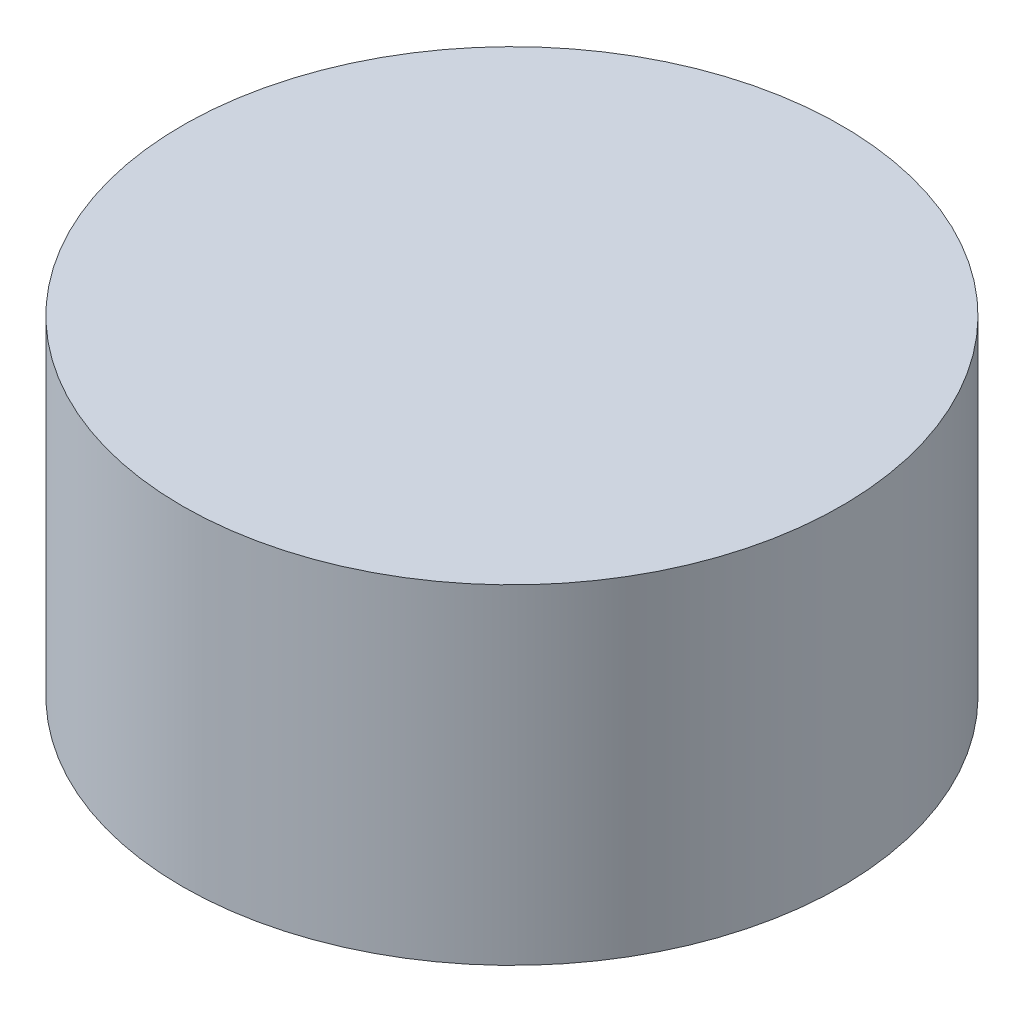
ISO-10303-21;
HEADER;
FILE_DESCRIPTION(('STEP AP214'),'2;1');
FILE_NAME('part.step','',(''),(''),'','','');
FILE_SCHEMA(('AUTOMOTIVE_DESIGN { 1 0 10303 214 1 1 1 1 }'));
ENDSEC;
DATA;
#1=APPLICATION_CONTEXT('core data for automotive mechanical design processes');
#2=APPLICATION_PROTOCOL_DEFINITION('international standard','automotive_design',2000,#1);
#3=PRODUCT_CONTEXT('',#1,'mechanical');
#4=PRODUCT('Part','Part','',(#3));
#5=PRODUCT_RELATED_PRODUCT_CATEGORY('part','',(#4));
#6=PRODUCT_DEFINITION_FORMATION('','',#4);
#7=PRODUCT_DEFINITION_CONTEXT('part definition',#1,'design');
#8=PRODUCT_DEFINITION('design','',#6,#7);
#9=PRODUCT_DEFINITION_SHAPE('','',#8);
#10=(LENGTH_UNIT() NAMED_UNIT(*) SI_UNIT(.MILLI.,.METRE.));
#11=(NAMED_UNIT(*) PLANE_ANGLE_UNIT() SI_UNIT($,.RADIAN.));
#12=(NAMED_UNIT(*) SI_UNIT($,.STERADIAN.) SOLID_ANGLE_UNIT());
#13=UNCERTAINTY_MEASURE_WITH_UNIT(LENGTH_MEASURE(1.E-05),#10,'distance_accuracy_value','');
#14=(GEOMETRIC_REPRESENTATION_CONTEXT(3) GLOBAL_UNCERTAINTY_ASSIGNED_CONTEXT((#13)) GLOBAL_UNIT_ASSIGNED_CONTEXT((#10,
#11,#12)) REPRESENTATION_CONTEXT('',''));
#15=CARTESIAN_POINT('',(0.,0.,0.));
#16=DIRECTION('',(0.,0.,1.));
#17=DIRECTION('',(1.,0.,0.));
#18=AXIS2_PLACEMENT_3D('',#15,#16,#17);
#19=CARTESIAN_POINT('',(0.,3.,0.));
#20=DIRECTION('',(0.,-1.,0.));
#21=DIRECTION('',(0.,0.,-1.));
#22=AXIS2_PLACEMENT_3D('',#19,#20,#21);
#23=CYLINDRICAL_SURFACE('',#22,3.);
#24=CARTESIAN_POINT('',(0.,3.,0.));
#25=DIRECTION('',(0.,1.,0.));
#26=DIRECTION('',(0.,0.,1.));
#27=AXIS2_PLACEMENT_3D('',#24,#25,#26);
#28=CIRCLE('',#27,3.);
#29=CARTESIAN_POINT('',(0.,3.,3.));
#30=VERTEX_POINT('',#29);
#31=EDGE_CURVE('E10',#30,#30,#28,.T.);
#32=ORIENTED_EDGE('',*,*,#31,.F.);
#33=EDGE_LOOP('',(#32));
#34=FACE_BOUND('',#33,.T.);
#35=CARTESIAN_POINT('',(0.,0.,0.));
#36=DIRECTION('',(0.,1.,0.));
#37=DIRECTION('',(0.,0.,1.));
#38=AXIS2_PLACEMENT_3D('',#35,#36,#37);
#39=CIRCLE('',#38,3.);
#40=CARTESIAN_POINT('',(0.,0.,3.));
#41=VERTEX_POINT('',#40);
#42=EDGE_CURVE('E34',#41,#41,#39,.T.);
#43=ORIENTED_EDGE('',*,*,#42,.T.);
#44=EDGE_LOOP('',(#43));
#45=FACE_BOUND('',#44,.T.);
#46=ADVANCED_FACE('F31',(#34,#45),#23,.T.);
#47=CARTESIAN_POINT('',(0.,3.,0.));
#48=DIRECTION('',(0.,1.,0.));
#49=DIRECTION('',(0.,0.,1.));
#50=AXIS2_PLACEMENT_3D('',#47,#48,#49);
#51=PLANE('',#50);
#52=ORIENTED_EDGE('',*,*,#31,.T.);
#53=EDGE_LOOP('',(#52));
#54=FACE_BOUND('',#53,.T.);
#55=ADVANCED_FACE('F46',(#54),#51,.T.);
#56=CARTESIAN_POINT('',(0.,0.,0.));
#57=DIRECTION('',(0.,1.,0.));
#58=DIRECTION('',(0.,0.,1.));
#59=AXIS2_PLACEMENT_3D('',#56,#57,#58);
#60=PLANE('',#59);
#61=ORIENTED_EDGE('',*,*,#42,.F.);
#62=EDGE_LOOP('',(#61));
#63=FACE_BOUND('',#62,.T.);
#64=ADVANCED_FACE('F44',(#63),#60,.F.);
#65=CLOSED_SHELL('',(#46,#55,#64));
#66=MANIFOLD_SOLID_BREP('B2',#65);
#67=ADVANCED_BREP_SHAPE_REPRESENTATION('',(#18,#66),#14);
#68=SHAPE_DEFINITION_REPRESENTATION(#9,#67);
ENDSEC;
END-ISO-10303-21;
